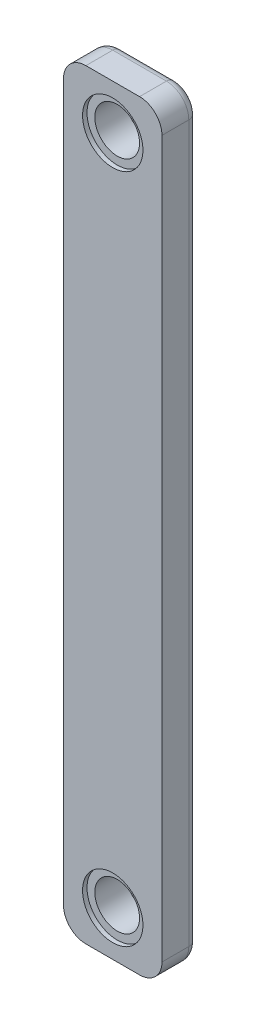
ISO-10303-21;
HEADER;
FILE_DESCRIPTION(('STEP AP214'),'2;1');
FILE_NAME('part.step','',(''),(''),'','','');
FILE_SCHEMA(('AUTOMOTIVE_DESIGN { 1 0 10303 214 1 1 1 1 }'));
ENDSEC;
DATA;
#1=APPLICATION_CONTEXT('core data for automotive mechanical design processes');
#2=APPLICATION_PROTOCOL_DEFINITION('international standard','automotive_design',2000,#1);
#3=PRODUCT_CONTEXT('',#1,'mechanical');
#4=PRODUCT('Part','Part','',(#3));
#5=PRODUCT_RELATED_PRODUCT_CATEGORY('part','',(#4));
#6=PRODUCT_DEFINITION_FORMATION('','',#4);
#7=PRODUCT_DEFINITION_CONTEXT('part definition',#1,'design');
#8=PRODUCT_DEFINITION('design','',#6,#7);
#9=PRODUCT_DEFINITION_SHAPE('','',#8);
#10=(LENGTH_UNIT() NAMED_UNIT(*) SI_UNIT(.MILLI.,.METRE.));
#11=(NAMED_UNIT(*) PLANE_ANGLE_UNIT() SI_UNIT($,.RADIAN.));
#12=(NAMED_UNIT(*) SI_UNIT($,.STERADIAN.) SOLID_ANGLE_UNIT());
#13=UNCERTAINTY_MEASURE_WITH_UNIT(LENGTH_MEASURE(1.E-05),#10,'distance_accuracy_value','');
#14=(GEOMETRIC_REPRESENTATION_CONTEXT(3) GLOBAL_UNCERTAINTY_ASSIGNED_CONTEXT((#13)) GLOBAL_UNIT_ASSIGNED_CONTEXT((#10,
#11,#12)) REPRESENTATION_CONTEXT('',''));
#15=CARTESIAN_POINT('',(0.,0.,0.));
#16=DIRECTION('',(0.,0.,1.));
#17=DIRECTION('',(1.,0.,0.));
#18=AXIS2_PLACEMENT_3D('',#15,#16,#17);
#19=CARTESIAN_POINT('',(0.,-75.,-4.));
#20=DIRECTION('',(0.,0.,1.));
#21=DIRECTION('',(1.,0.,0.));
#22=AXIS2_PLACEMENT_3D('',#19,#20,#21);
#23=CYLINDRICAL_SURFACE('',#22,5.);
#24=CARTESIAN_POINT('',(0.,-75.,-4.));
#25=DIRECTION('',(0.,0.,1.));
#26=DIRECTION('',(1.,0.,0.));
#27=AXIS2_PLACEMENT_3D('',#24,#25,#26);
#28=CIRCLE('',#27,5.);
#29=CARTESIAN_POINT('',(5.,-75.,-4.));
#30=VERTEX_POINT('',#29);
#31=EDGE_CURVE('E309',#30,#30,#28,.T.);
#32=ORIENTED_EDGE('',*,*,#31,.F.);
#33=EDGE_LOOP('',(#32));
#34=FACE_BOUND('',#33,.T.);
#35=CARTESIAN_POINT('',(0.,-75.,3.));
#36=DIRECTION('',(0.,0.,1.));
#37=DIRECTION('',(1.,0.,0.));
#38=AXIS2_PLACEMENT_3D('',#35,#36,#37);
#39=CIRCLE('',#38,5.);
#40=CARTESIAN_POINT('',(5.,-75.,3.));
#41=VERTEX_POINT('',#40);
#42=EDGE_CURVE('E63',#41,#41,#39,.F.);
#43=ORIENTED_EDGE('',*,*,#42,.F.);
#44=EDGE_LOOP('',(#43));
#45=FACE_BOUND('',#44,.T.);
#46=ADVANCED_FACE('F59',(#34,#45),#23,.F.);
#47=CARTESIAN_POINT('',(0.,75.,-4.));
#48=DIRECTION('',(0.,0.,1.));
#49=DIRECTION('',(1.,0.,0.));
#50=AXIS2_PLACEMENT_3D('',#47,#48,#49);
#51=CYLINDRICAL_SURFACE('',#50,5.);
#52=CARTESIAN_POINT('',(0.,75.,-4.));
#53=DIRECTION('',(0.,0.,1.));
#54=DIRECTION('',(1.,0.,0.));
#55=AXIS2_PLACEMENT_3D('',#52,#53,#54);
#56=CIRCLE('',#55,5.);
#57=CARTESIAN_POINT('',(5.,75.,-4.));
#58=VERTEX_POINT('',#57);
#59=EDGE_CURVE('E281',#58,#58,#56,.T.);
#60=ORIENTED_EDGE('',*,*,#59,.F.);
#61=EDGE_LOOP('',(#60));
#62=FACE_BOUND('',#61,.T.);
#63=CARTESIAN_POINT('',(0.,75.,3.));
#64=DIRECTION('',(0.,0.,1.));
#65=DIRECTION('',(1.,0.,0.));
#66=AXIS2_PLACEMENT_3D('',#63,#64,#65);
#67=CIRCLE('',#66,5.);
#68=CARTESIAN_POINT('',(5.,75.,3.));
#69=VERTEX_POINT('',#68);
#70=EDGE_CURVE('E306',#69,#69,#67,.F.);
#71=ORIENTED_EDGE('',*,*,#70,.F.);
#72=EDGE_LOOP('',(#71));
#73=FACE_BOUND('',#72,.T.);
#74=ADVANCED_FACE('F420',(#62,#73),#51,.F.);
#75=CARTESIAN_POINT('',(11.,-85.,4.));
#76=DIRECTION('',(-1.,0.,0.));
#77=DIRECTION('',(0.,0.,1.));
#78=AXIS2_PLACEMENT_3D('',#75,#76,#77);
#79=PLANE('',#78);
#80=DIRECTION('',(0.,0.,-1.));
#81=VECTOR('',#80,1.);
#82=CARTESIAN_POINT('',(11.,-80.,4.));
#83=LINE('',#82,#81);
#84=CARTESIAN_POINT('',(11.,-80.,4.));
#85=VERTEX_POINT('',#84);
#86=CARTESIAN_POINT('',(11.,-80.,-2.));
#87=VERTEX_POINT('',#86);
#88=EDGE_CURVE('E189',#85,#87,#83,.T.);
#89=ORIENTED_EDGE('',*,*,#88,.T.);
#90=DIRECTION('',(0.,1.,0.));
#91=VECTOR('',#90,1.);
#92=CARTESIAN_POINT('',(11.,80.,-2.));
#93=LINE('',#92,#91);
#94=CARTESIAN_POINT('',(11.,80.,-2.));
#95=VERTEX_POINT('',#94);
#96=EDGE_CURVE('E13',#87,#95,#93,.T.);
#97=ORIENTED_EDGE('',*,*,#96,.T.);
#98=DIRECTION('',(0.,0.,-1.));
#99=VECTOR('',#98,1.);
#100=CARTESIAN_POINT('',(11.,80.,4.));
#101=LINE('',#100,#99);
#102=CARTESIAN_POINT('',(11.,80.,4.));
#103=VERTEX_POINT('',#102);
#104=EDGE_CURVE('E192',#95,#103,#101,.F.);
#105=ORIENTED_EDGE('',*,*,#104,.T.);
#106=DIRECTION('',(0.,1.,0.));
#107=VECTOR('',#106,1.);
#108=CARTESIAN_POINT('',(11.,-85.,4.));
#109=LINE('',#108,#107);
#110=EDGE_CURVE('E179',#85,#103,#109,.T.);
#111=ORIENTED_EDGE('',*,*,#110,.F.);
#112=EDGE_LOOP('',(#89,#97,#105,#111));
#113=FACE_BOUND('',#112,.T.);
#114=ADVANCED_FACE('F188',(#113),#79,.F.);
#115=CARTESIAN_POINT('',(-11.,85.,4.));
#116=DIRECTION('',(0.,-1.,0.));
#117=DIRECTION('',(0.,0.,-1.));
#118=AXIS2_PLACEMENT_3D('',#115,#116,#117);
#119=PLANE('',#118);
#120=DIRECTION('',(0.,0.,-1.));
#121=VECTOR('',#120,1.);
#122=CARTESIAN_POINT('',(5.99999999999999,85.,4.));
#123=LINE('',#122,#121);
#124=CARTESIAN_POINT('',(5.99999999999999,85.,4.));
#125=VERTEX_POINT('',#124);
#126=CARTESIAN_POINT('',(5.99999999999999,85.,-2.));
#127=VERTEX_POINT('',#126);
#128=EDGE_CURVE('E226',#125,#127,#123,.T.);
#129=ORIENTED_EDGE('',*,*,#128,.T.);
#130=DIRECTION('',(-1.,0.,0.));
#131=VECTOR('',#130,1.);
#132=CARTESIAN_POINT('',(-6.,85.,-2.));
#133=LINE('',#132,#131);
#134=CARTESIAN_POINT('',(-6.,85.,-2.));
#135=VERTEX_POINT('',#134);
#136=EDGE_CURVE('E261',#127,#135,#133,.T.);
#137=ORIENTED_EDGE('',*,*,#136,.T.);
#138=DIRECTION('',(0.,0.,-1.));
#139=VECTOR('',#138,1.);
#140=CARTESIAN_POINT('',(-6.,85.,4.));
#141=LINE('',#140,#139);
#142=CARTESIAN_POINT('',(-6.,85.,4.));
#143=VERTEX_POINT('',#142);
#144=EDGE_CURVE('E230',#135,#143,#141,.F.);
#145=ORIENTED_EDGE('',*,*,#144,.T.);
#146=DIRECTION('',(-1.,0.,0.));
#147=VECTOR('',#146,1.);
#148=CARTESIAN_POINT('',(-11.,85.,4.));
#149=LINE('',#148,#147);
#150=EDGE_CURVE('E194',#125,#143,#149,.T.);
#151=ORIENTED_EDGE('',*,*,#150,.F.);
#152=EDGE_LOOP('',(#129,#137,#145,#151));
#153=FACE_BOUND('',#152,.T.);
#154=ADVANCED_FACE('F438',(#153),#119,.F.);
#155=CARTESIAN_POINT('',(-11.,-85.,4.));
#156=DIRECTION('',(1.,0.,0.));
#157=DIRECTION('',(0.,0.,-1.));
#158=AXIS2_PLACEMENT_3D('',#155,#156,#157);
#159=PLANE('',#158);
#160=DIRECTION('',(0.,0.,-1.));
#161=VECTOR('',#160,1.);
#162=CARTESIAN_POINT('',(-11.,80.,4.));
#163=LINE('',#162,#161);
#164=CARTESIAN_POINT('',(-11.,80.,4.));
#165=VERTEX_POINT('',#164);
#166=CARTESIAN_POINT('',(-11.,80.,-2.));
#167=VERTEX_POINT('',#166);
#168=EDGE_CURVE('E184',#165,#167,#163,.T.);
#169=ORIENTED_EDGE('',*,*,#168,.T.);
#170=DIRECTION('',(0.,-1.,0.));
#171=VECTOR('',#170,1.);
#172=CARTESIAN_POINT('',(-11.,-80.,-2.));
#173=LINE('',#172,#171);
#174=CARTESIAN_POINT('',(-11.,-80.,-2.));
#175=VERTEX_POINT('',#174);
#176=EDGE_CURVE('E267',#167,#175,#173,.T.);
#177=ORIENTED_EDGE('',*,*,#176,.T.);
#178=DIRECTION('',(0.,0.,-1.));
#179=VECTOR('',#178,1.);
#180=CARTESIAN_POINT('',(-11.,-80.,4.));
#181=LINE('',#180,#179);
#182=CARTESIAN_POINT('',(-11.,-80.,4.));
#183=VERTEX_POINT('',#182);
#184=EDGE_CURVE('E223',#175,#183,#181,.F.);
#185=ORIENTED_EDGE('',*,*,#184,.T.);
#186=DIRECTION('',(0.,-1.,0.));
#187=VECTOR('',#186,1.);
#188=CARTESIAN_POINT('',(-11.,-85.,4.));
#189=LINE('',#188,#187);
#190=EDGE_CURVE('E337',#165,#183,#189,.T.);
#191=ORIENTED_EDGE('',*,*,#190,.F.);
#192=EDGE_LOOP('',(#169,#177,#185,#191));
#193=FACE_BOUND('',#192,.T.);
#194=ADVANCED_FACE('F435',(#193),#159,.F.);
#195=CARTESIAN_POINT('',(-11.,-85.,4.));
#196=DIRECTION('',(0.,1.,0.));
#197=DIRECTION('',(0.,0.,1.));
#198=AXIS2_PLACEMENT_3D('',#195,#196,#197);
#199=PLANE('',#198);
#200=DIRECTION('',(0.,0.,-1.));
#201=VECTOR('',#200,1.);
#202=CARTESIAN_POINT('',(-6.,-85.,4.));
#203=LINE('',#202,#201);
#204=CARTESIAN_POINT('',(-6.,-85.,4.));
#205=VERTEX_POINT('',#204);
#206=CARTESIAN_POINT('',(-6.,-85.,-2.));
#207=VERTEX_POINT('',#206);
#208=EDGE_CURVE('E199',#205,#207,#203,.T.);
#209=ORIENTED_EDGE('',*,*,#208,.T.);
#210=DIRECTION('',(1.,0.,0.));
#211=VECTOR('',#210,1.);
#212=CARTESIAN_POINT('',(5.99999999999999,-85.,-2.));
#213=LINE('',#212,#211);
#214=CARTESIAN_POINT('',(5.99999999999999,-85.,-2.));
#215=VERTEX_POINT('',#214);
#216=EDGE_CURVE('E90',#207,#215,#213,.T.);
#217=ORIENTED_EDGE('',*,*,#216,.T.);
#218=DIRECTION('',(0.,0.,-1.));
#219=VECTOR('',#218,1.);
#220=CARTESIAN_POINT('',(5.99999999999999,-85.,4.));
#221=LINE('',#220,#219);
#222=CARTESIAN_POINT('',(5.99999999999999,-85.,4.));
#223=VERTEX_POINT('',#222);
#224=EDGE_CURVE('E205',#215,#223,#221,.F.);
#225=ORIENTED_EDGE('',*,*,#224,.T.);
#226=DIRECTION('',(1.,0.,0.));
#227=VECTOR('',#226,1.);
#228=CARTESIAN_POINT('',(-11.,-85.,4.));
#229=LINE('',#228,#227);
#230=EDGE_CURVE('E182',#205,#223,#229,.T.);
#231=ORIENTED_EDGE('',*,*,#230,.F.);
#232=EDGE_LOOP('',(#209,#217,#225,#231));
#233=FACE_BOUND('',#232,.T.);
#234=ADVANCED_FACE('F400',(#233),#199,.F.);
#235=CARTESIAN_POINT('',(0.,0.,4.));
#236=DIRECTION('',(0.,0.,-1.));
#237=DIRECTION('',(-1.,0.,0.));
#238=AXIS2_PLACEMENT_3D('',#235,#236,#237);
#239=PLANE('',#238);
#240=CARTESIAN_POINT('',(0.,-75.,4.));
#241=DIRECTION('',(0.,0.,1.));
#242=DIRECTION('',(1.,0.,0.));
#243=AXIS2_PLACEMENT_3D('',#240,#241,#242);
#244=CIRCLE('',#243,6.75);
#245=CARTESIAN_POINT('',(6.75,-75.,4.));
#246=VERTEX_POINT('',#245);
#247=EDGE_CURVE('E328',#246,#246,#244,.T.);
#248=ORIENTED_EDGE('',*,*,#247,.F.);
#249=EDGE_LOOP('',(#248));
#250=FACE_BOUND('',#249,.T.);
#251=CARTESIAN_POINT('',(0.,75.,4.));
#252=DIRECTION('',(0.,0.,1.));
#253=DIRECTION('',(1.,0.,0.));
#254=AXIS2_PLACEMENT_3D('',#251,#252,#253);
#255=CIRCLE('',#254,6.75);
#256=CARTESIAN_POINT('',(6.75,75.,4.));
#257=VERTEX_POINT('',#256);
#258=EDGE_CURVE('E319',#257,#257,#255,.T.);
#259=ORIENTED_EDGE('',*,*,#258,.F.);
#260=EDGE_LOOP('',(#259));
#261=FACE_BOUND('',#260,.T.);
#262=ORIENTED_EDGE('',*,*,#230,.T.);
#263=CARTESIAN_POINT('',(6.,-80.,4.));
#264=DIRECTION('',(0.,0.,-1.));
#265=DIRECTION('',(-1.,0.,0.));
#266=AXIS2_PLACEMENT_3D('',#263,#264,#265);
#267=CIRCLE('',#266,5.);
#268=EDGE_CURVE('E176',#223,#85,#267,.F.);
#269=ORIENTED_EDGE('',*,*,#268,.T.);
#270=ORIENTED_EDGE('',*,*,#110,.T.);
#271=CARTESIAN_POINT('',(5.99999999999999,80.,4.));
#272=DIRECTION('',(0.,0.,-1.));
#273=DIRECTION('',(-1.,0.,0.));
#274=AXIS2_PLACEMENT_3D('',#271,#272,#273);
#275=CIRCLE('',#274,5.);
#276=EDGE_CURVE('E213',#103,#125,#275,.F.);
#277=ORIENTED_EDGE('',*,*,#276,.T.);
#278=ORIENTED_EDGE('',*,*,#150,.T.);
#279=CARTESIAN_POINT('',(-6.,80.,4.));
#280=DIRECTION('',(0.,0.,-1.));
#281=DIRECTION('',(-1.,0.,0.));
#282=AXIS2_PLACEMENT_3D('',#279,#280,#281);
#283=CIRCLE('',#282,5.);
#284=EDGE_CURVE('E216',#143,#165,#283,.F.);
#285=ORIENTED_EDGE('',*,*,#284,.T.);
#286=ORIENTED_EDGE('',*,*,#190,.T.);
#287=CARTESIAN_POINT('',(-6.,-80.,4.));
#288=DIRECTION('',(0.,0.,-1.));
#289=DIRECTION('',(-1.,0.,0.));
#290=AXIS2_PLACEMENT_3D('',#287,#288,#289);
#291=CIRCLE('',#290,5.);
#292=EDGE_CURVE('E185',#183,#205,#291,.F.);
#293=ORIENTED_EDGE('',*,*,#292,.T.);
#294=EDGE_LOOP('',(#262,#269,#270,#277,#278,#285,#286,#293));
#295=FACE_BOUND('',#294,.T.);
#296=ADVANCED_FACE('F178',(#250,#261,#295),#239,.F.);
#297=CARTESIAN_POINT('',(0.,0.,-4.));
#298=DIRECTION('',(0.,0.,-1.));
#299=DIRECTION('',(-1.,0.,0.));
#300=AXIS2_PLACEMENT_3D('',#297,#298,#299);
#301=PLANE('',#300);
#302=ORIENTED_EDGE('',*,*,#31,.T.);
#303=EDGE_LOOP('',(#302));
#304=FACE_BOUND('',#303,.T.);
#305=ORIENTED_EDGE('',*,*,#59,.T.);
#306=EDGE_LOOP('',(#305));
#307=FACE_BOUND('',#306,.T.);
#308=DIRECTION('',(-1.,0.,0.));
#309=VECTOR('',#308,1.);
#310=CARTESIAN_POINT('',(5.99999999999999,83.,-4.));
#311=LINE('',#310,#309);
#312=CARTESIAN_POINT('',(-6.,83.,-4.));
#313=VERTEX_POINT('',#312);
#314=CARTESIAN_POINT('',(5.99999999999999,83.,-4.));
#315=VERTEX_POINT('',#314);
#316=EDGE_CURVE('E250',#313,#315,#311,.F.);
#317=ORIENTED_EDGE('',*,*,#316,.T.);
#318=CARTESIAN_POINT('',(5.99999999999999,80.,-4.));
#319=DIRECTION('',(0.,0.,-1.));
#320=DIRECTION('',(-1.,0.,0.));
#321=AXIS2_PLACEMENT_3D('',#318,#319,#320);
#322=CIRCLE('',#321,3.);
#323=CARTESIAN_POINT('',(9.,80.,-4.));
#324=VERTEX_POINT('',#323);
#325=EDGE_CURVE('E253',#315,#324,#322,.T.);
#326=ORIENTED_EDGE('',*,*,#325,.T.);
#327=DIRECTION('',(0.,1.,0.));
#328=VECTOR('',#327,1.);
#329=CARTESIAN_POINT('',(9.,-80.,-4.));
#330=LINE('',#329,#328);
#331=CARTESIAN_POINT('',(9.,-80.,-4.));
#332=VERTEX_POINT('',#331);
#333=EDGE_CURVE('E233',#324,#332,#330,.F.);
#334=ORIENTED_EDGE('',*,*,#333,.T.);
#335=CARTESIAN_POINT('',(6.,-80.,-4.));
#336=DIRECTION('',(0.,0.,-1.));
#337=DIRECTION('',(-1.,0.,0.));
#338=AXIS2_PLACEMENT_3D('',#335,#336,#337);
#339=CIRCLE('',#338,3.);
#340=CARTESIAN_POINT('',(5.99999999999999,-83.,-4.));
#341=VERTEX_POINT('',#340);
#342=EDGE_CURVE('E236',#332,#341,#339,.T.);
#343=ORIENTED_EDGE('',*,*,#342,.T.);
#344=DIRECTION('',(1.,0.,0.));
#345=VECTOR('',#344,1.);
#346=CARTESIAN_POINT('',(-6.,-83.,-4.));
#347=LINE('',#346,#345);
#348=CARTESIAN_POINT('',(-6.,-83.,-4.));
#349=VERTEX_POINT('',#348);
#350=EDGE_CURVE('E238',#341,#349,#347,.F.);
#351=ORIENTED_EDGE('',*,*,#350,.T.);
#352=CARTESIAN_POINT('',(-6.,-80.,-4.));
#353=DIRECTION('',(0.,0.,-1.));
#354=DIRECTION('',(-1.,0.,0.));
#355=AXIS2_PLACEMENT_3D('',#352,#353,#354);
#356=CIRCLE('',#355,3.);
#357=CARTESIAN_POINT('',(-9.,-80.,-4.));
#358=VERTEX_POINT('',#357);
#359=EDGE_CURVE('E241',#349,#358,#356,.T.);
#360=ORIENTED_EDGE('',*,*,#359,.T.);
#361=DIRECTION('',(0.,-1.,0.));
#362=VECTOR('',#361,1.);
#363=CARTESIAN_POINT('',(-9.,80.,-4.));
#364=LINE('',#363,#362);
#365=CARTESIAN_POINT('',(-9.,80.,-4.));
#366=VERTEX_POINT('',#365);
#367=EDGE_CURVE('E244',#358,#366,#364,.F.);
#368=ORIENTED_EDGE('',*,*,#367,.T.);
#369=CARTESIAN_POINT('',(-6.,80.,-4.));
#370=DIRECTION('',(0.,0.,-1.));
#371=DIRECTION('',(-1.,0.,0.));
#372=AXIS2_PLACEMENT_3D('',#369,#370,#371);
#373=CIRCLE('',#372,3.);
#374=EDGE_CURVE('E247',#366,#313,#373,.T.);
#375=ORIENTED_EDGE('',*,*,#374,.T.);
#376=EDGE_LOOP('',(#317,#326,#334,#343,#351,#360,#368,#375));
#377=FACE_BOUND('',#376,.T.);
#378=ADVANCED_FACE('F399',(#304,#307,#377),#301,.T.);
#379=CARTESIAN_POINT('',(6.,-80.,4.));
#380=DIRECTION('',(0.,0.,-1.));
#381=DIRECTION('',(-1.,0.,0.));
#382=AXIS2_PLACEMENT_3D('',#379,#380,#381);
#383=CYLINDRICAL_SURFACE('',#382,5.);
#384=ORIENTED_EDGE('',*,*,#224,.F.);
#385=CARTESIAN_POINT('',(6.,-80.,-2.));
#386=DIRECTION('',(0.,0.,-1.));
#387=DIRECTION('',(-1.,0.,0.));
#388=AXIS2_PLACEMENT_3D('',#385,#386,#387);
#389=CIRCLE('',#388,5.);
#390=EDGE_CURVE('E69',#215,#87,#389,.F.);
#391=ORIENTED_EDGE('',*,*,#390,.T.);
#392=ORIENTED_EDGE('',*,*,#88,.F.);
#393=ORIENTED_EDGE('',*,*,#268,.F.);
#394=EDGE_LOOP('',(#384,#391,#392,#393));
#395=FACE_BOUND('',#394,.T.);
#396=ADVANCED_FACE('F197',(#395),#383,.T.);
#397=CARTESIAN_POINT('',(-6.,-80.,4.));
#398=DIRECTION('',(0.,0.,-1.));
#399=DIRECTION('',(-1.,0.,0.));
#400=AXIS2_PLACEMENT_3D('',#397,#398,#399);
#401=CYLINDRICAL_SURFACE('',#400,5.);
#402=ORIENTED_EDGE('',*,*,#184,.F.);
#403=CARTESIAN_POINT('',(-6.,-80.,-2.));
#404=DIRECTION('',(0.,0.,-1.));
#405=DIRECTION('',(-1.,0.,0.));
#406=AXIS2_PLACEMENT_3D('',#403,#404,#405);
#407=CIRCLE('',#406,5.);
#408=EDGE_CURVE('E270',#175,#207,#407,.F.);
#409=ORIENTED_EDGE('',*,*,#408,.T.);
#410=ORIENTED_EDGE('',*,*,#208,.F.);
#411=ORIENTED_EDGE('',*,*,#292,.F.);
#412=EDGE_LOOP('',(#402,#409,#410,#411));
#413=FACE_BOUND('',#412,.T.);
#414=ADVANCED_FACE('F447',(#413),#401,.T.);
#415=CARTESIAN_POINT('',(-6.,80.,4.));
#416=DIRECTION('',(0.,0.,-1.));
#417=DIRECTION('',(-1.,0.,0.));
#418=AXIS2_PLACEMENT_3D('',#415,#416,#417);
#419=CYLINDRICAL_SURFACE('',#418,5.);
#420=ORIENTED_EDGE('',*,*,#144,.F.);
#421=CARTESIAN_POINT('',(-6.,80.,-2.));
#422=DIRECTION('',(0.,0.,-1.));
#423=DIRECTION('',(-1.,0.,0.));
#424=AXIS2_PLACEMENT_3D('',#421,#422,#423);
#425=CIRCLE('',#424,5.);
#426=EDGE_CURVE('E264',#135,#167,#425,.F.);
#427=ORIENTED_EDGE('',*,*,#426,.T.);
#428=ORIENTED_EDGE('',*,*,#168,.F.);
#429=ORIENTED_EDGE('',*,*,#284,.F.);
#430=EDGE_LOOP('',(#420,#427,#428,#429));
#431=FACE_BOUND('',#430,.T.);
#432=ADVANCED_FACE('F450',(#431),#419,.T.);
#433=CARTESIAN_POINT('',(5.99999999999999,80.,4.));
#434=DIRECTION('',(0.,0.,-1.));
#435=DIRECTION('',(-1.,0.,0.));
#436=AXIS2_PLACEMENT_3D('',#433,#434,#435);
#437=CYLINDRICAL_SURFACE('',#436,5.);
#438=ORIENTED_EDGE('',*,*,#104,.F.);
#439=CARTESIAN_POINT('',(5.99999999999999,80.,-2.));
#440=DIRECTION('',(0.,0.,-1.));
#441=DIRECTION('',(-1.,0.,0.));
#442=AXIS2_PLACEMENT_3D('',#439,#440,#441);
#443=CIRCLE('',#442,5.);
#444=EDGE_CURVE('E257',#95,#127,#443,.F.);
#445=ORIENTED_EDGE('',*,*,#444,.T.);
#446=ORIENTED_EDGE('',*,*,#128,.F.);
#447=ORIENTED_EDGE('',*,*,#276,.F.);
#448=EDGE_LOOP('',(#438,#445,#446,#447));
#449=FACE_BOUND('',#448,.T.);
#450=ADVANCED_FACE('F454',(#449),#437,.T.);
#451=CARTESIAN_POINT('',(-6.,-80.,-2.));
#452=DIRECTION('',(0.,0.,-1.));
#453=DIRECTION('',(-1.,0.,0.));
#454=AXIS2_PLACEMENT_3D('',#451,#452,#453);
#455=TOROIDAL_SURFACE('',#454,3.,2.);
#456=CARTESIAN_POINT('',(-6.,-83.,-2.));
#457=DIRECTION('',(1.,0.,0.));
#458=DIRECTION('',(0.,0.,-1.));
#459=AXIS2_PLACEMENT_3D('',#456,#457,#458);
#460=CIRCLE('',#459,2.);
#461=EDGE_CURVE('E300',#207,#349,#460,.T.);
#462=ORIENTED_EDGE('',*,*,#461,.F.);
#463=ORIENTED_EDGE('',*,*,#408,.F.);
#464=CARTESIAN_POINT('',(-9.,-80.,-2.));
#465=DIRECTION('',(0.,1.,0.));
#466=DIRECTION('',(0.,0.,1.));
#467=AXIS2_PLACEMENT_3D('',#464,#465,#466);
#468=CIRCLE('',#467,2.);
#469=EDGE_CURVE('E195',#358,#175,#468,.T.);
#470=ORIENTED_EDGE('',*,*,#469,.F.);
#471=ORIENTED_EDGE('',*,*,#359,.F.);
#472=EDGE_LOOP('',(#462,#463,#470,#471));
#473=FACE_BOUND('',#472,.T.);
#474=ADVANCED_FACE('F61',(#473),#455,.T.);
#475=CARTESIAN_POINT('',(-9.,-85.,-2.));
#476=DIRECTION('',(0.,1.,0.));
#477=DIRECTION('',(0.,0.,1.));
#478=AXIS2_PLACEMENT_3D('',#475,#476,#477);
#479=CYLINDRICAL_SURFACE('',#478,2.);
#480=ORIENTED_EDGE('',*,*,#469,.T.);
#481=ORIENTED_EDGE('',*,*,#176,.F.);
#482=CARTESIAN_POINT('',(-9.,80.,-2.));
#483=DIRECTION('',(0.,1.,0.));
#484=DIRECTION('',(0.,0.,1.));
#485=AXIS2_PLACEMENT_3D('',#482,#483,#484);
#486=CIRCLE('',#485,2.);
#487=EDGE_CURVE('E296',#366,#167,#486,.T.);
#488=ORIENTED_EDGE('',*,*,#487,.F.);
#489=ORIENTED_EDGE('',*,*,#367,.F.);
#490=EDGE_LOOP('',(#480,#481,#488,#489));
#491=FACE_BOUND('',#490,.T.);
#492=ADVANCED_FACE('F480',(#491),#479,.T.);
#493=CARTESIAN_POINT('',(-11.,-83.,-2.));
#494=DIRECTION('',(-1.,0.,0.));
#495=DIRECTION('',(0.,0.,1.));
#496=AXIS2_PLACEMENT_3D('',#493,#494,#495);
#497=CYLINDRICAL_SURFACE('',#496,2.);
#498=ORIENTED_EDGE('',*,*,#461,.T.);
#499=ORIENTED_EDGE('',*,*,#350,.F.);
#500=CARTESIAN_POINT('',(5.99999999999999,-83.,-2.));
#501=DIRECTION('',(1.,0.,0.));
#502=DIRECTION('',(0.,0.,-1.));
#503=AXIS2_PLACEMENT_3D('',#500,#501,#502);
#504=CIRCLE('',#503,2.);
#505=EDGE_CURVE('E292',#215,#341,#504,.T.);
#506=ORIENTED_EDGE('',*,*,#505,.F.);
#507=ORIENTED_EDGE('',*,*,#216,.F.);
#508=EDGE_LOOP('',(#498,#499,#506,#507));
#509=FACE_BOUND('',#508,.T.);
#510=ADVANCED_FACE('F477',(#509),#497,.T.);
#511=CARTESIAN_POINT('',(-6.,80.,-2.));
#512=DIRECTION('',(0.,0.,-1.));
#513=DIRECTION('',(-1.,0.,0.));
#514=AXIS2_PLACEMENT_3D('',#511,#512,#513);
#515=TOROIDAL_SURFACE('',#514,3.,2.);
#516=ORIENTED_EDGE('',*,*,#487,.T.);
#517=ORIENTED_EDGE('',*,*,#426,.F.);
#518=CARTESIAN_POINT('',(-6.,83.,-2.));
#519=DIRECTION('',(1.,0.,0.));
#520=DIRECTION('',(0.,0.,-1.));
#521=AXIS2_PLACEMENT_3D('',#518,#519,#520);
#522=CIRCLE('',#521,2.);
#523=EDGE_CURVE('E288',#313,#135,#522,.T.);
#524=ORIENTED_EDGE('',*,*,#523,.F.);
#525=ORIENTED_EDGE('',*,*,#374,.F.);
#526=EDGE_LOOP('',(#516,#517,#524,#525));
#527=FACE_BOUND('',#526,.T.);
#528=ADVANCED_FACE('F473',(#527),#515,.T.);
#529=CARTESIAN_POINT('',(6.,-80.,-2.));
#530=DIRECTION('',(0.,0.,-1.));
#531=DIRECTION('',(-1.,0.,0.));
#532=AXIS2_PLACEMENT_3D('',#529,#530,#531);
#533=TOROIDAL_SURFACE('',#532,3.,2.);
#534=ORIENTED_EDGE('',*,*,#505,.T.);
#535=ORIENTED_EDGE('',*,*,#342,.F.);
#536=CARTESIAN_POINT('',(9.,-80.,-2.));
#537=DIRECTION('',(0.,1.,0.));
#538=DIRECTION('',(0.,0.,1.));
#539=AXIS2_PLACEMENT_3D('',#536,#537,#538);
#540=CIRCLE('',#539,2.);
#541=EDGE_CURVE('E284',#87,#332,#540,.T.);
#542=ORIENTED_EDGE('',*,*,#541,.F.);
#543=ORIENTED_EDGE('',*,*,#390,.F.);
#544=EDGE_LOOP('',(#534,#535,#542,#543));
#545=FACE_BOUND('',#544,.T.);
#546=ADVANCED_FACE('F469',(#545),#533,.T.);
#547=CARTESIAN_POINT('',(-11.,83.,-2.));
#548=DIRECTION('',(1.,0.,0.));
#549=DIRECTION('',(0.,0.,-1.));
#550=AXIS2_PLACEMENT_3D('',#547,#548,#549);
#551=CYLINDRICAL_SURFACE('',#550,2.);
#552=ORIENTED_EDGE('',*,*,#523,.T.);
#553=ORIENTED_EDGE('',*,*,#136,.F.);
#554=CARTESIAN_POINT('',(5.99999999999999,83.,-2.));
#555=DIRECTION('',(1.,0.,0.));
#556=DIRECTION('',(0.,0.,-1.));
#557=AXIS2_PLACEMENT_3D('',#554,#555,#556);
#558=CIRCLE('',#557,2.);
#559=EDGE_CURVE('E280',#315,#127,#558,.T.);
#560=ORIENTED_EDGE('',*,*,#559,.F.);
#561=ORIENTED_EDGE('',*,*,#316,.F.);
#562=EDGE_LOOP('',(#552,#553,#560,#561));
#563=FACE_BOUND('',#562,.T.);
#564=ADVANCED_FACE('F465',(#563),#551,.T.);
#565=CARTESIAN_POINT('',(9.,-85.,-2.));
#566=DIRECTION('',(0.,-1.,0.));
#567=DIRECTION('',(0.,0.,-1.));
#568=AXIS2_PLACEMENT_3D('',#565,#566,#567);
#569=CYLINDRICAL_SURFACE('',#568,2.);
#570=ORIENTED_EDGE('',*,*,#541,.T.);
#571=ORIENTED_EDGE('',*,*,#333,.F.);
#572=CARTESIAN_POINT('',(9.,80.,-2.));
#573=DIRECTION('',(0.,1.,0.));
#574=DIRECTION('',(0.,0.,1.));
#575=AXIS2_PLACEMENT_3D('',#572,#573,#574);
#576=CIRCLE('',#575,2.);
#577=EDGE_CURVE('E277',#95,#324,#576,.T.);
#578=ORIENTED_EDGE('',*,*,#577,.F.);
#579=ORIENTED_EDGE('',*,*,#96,.F.);
#580=EDGE_LOOP('',(#570,#571,#578,#579));
#581=FACE_BOUND('',#580,.T.);
#582=ADVANCED_FACE('F461',(#581),#569,.T.);
#583=CARTESIAN_POINT('',(5.99999999999999,80.,-2.));
#584=DIRECTION('',(0.,0.,-1.));
#585=DIRECTION('',(-1.,0.,0.));
#586=AXIS2_PLACEMENT_3D('',#583,#584,#585);
#587=TOROIDAL_SURFACE('',#586,3.,2.);
#588=ORIENTED_EDGE('',*,*,#559,.T.);
#589=ORIENTED_EDGE('',*,*,#444,.F.);
#590=ORIENTED_EDGE('',*,*,#577,.T.);
#591=ORIENTED_EDGE('',*,*,#325,.F.);
#592=EDGE_LOOP('',(#588,#589,#590,#591));
#593=FACE_BOUND('',#592,.T.);
#594=ADVANCED_FACE('F416',(#593),#587,.T.);
#595=CARTESIAN_POINT('',(0.,75.,3.));
#596=DIRECTION('',(0.,0.,1.));
#597=DIRECTION('',(1.,0.,0.));
#598=AXIS2_PLACEMENT_3D('',#595,#596,#597);
#599=PLANE('',#598);
#600=CARTESIAN_POINT('',(0.,75.,3.));
#601=DIRECTION('',(0.,0.,1.));
#602=DIRECTION('',(1.,0.,0.));
#603=AXIS2_PLACEMENT_3D('',#600,#601,#602);
#604=CIRCLE('',#603,6.75);
#605=CARTESIAN_POINT('',(6.75,75.,3.));
#606=VERTEX_POINT('',#605);
#607=EDGE_CURVE('E310',#606,#606,#604,.T.);
#608=ORIENTED_EDGE('',*,*,#607,.T.);
#609=EDGE_LOOP('',(#608));
#610=FACE_BOUND('',#609,.T.);
#611=ORIENTED_EDGE('',*,*,#70,.T.);
#612=EDGE_LOOP('',(#611));
#613=FACE_BOUND('',#612,.T.);
#614=ADVANCED_FACE('F407',(#610,#613),#599,.T.);
#615=CARTESIAN_POINT('',(0.,75.,3.));
#616=DIRECTION('',(0.,0.,1.));
#617=DIRECTION('',(1.,0.,0.));
#618=AXIS2_PLACEMENT_3D('',#615,#616,#617);
#619=CYLINDRICAL_SURFACE('',#618,6.75);
#620=ORIENTED_EDGE('',*,*,#607,.F.);
#621=EDGE_LOOP('',(#620));
#622=FACE_BOUND('',#621,.T.);
#623=ORIENTED_EDGE('',*,*,#258,.T.);
#624=EDGE_LOOP('',(#623));
#625=FACE_BOUND('',#624,.T.);
#626=ADVANCED_FACE('F404',(#622,#625),#619,.F.);
#627=CARTESIAN_POINT('',(0.,-75.,3.));
#628=DIRECTION('',(0.,0.,1.));
#629=DIRECTION('',(1.,0.,0.));
#630=AXIS2_PLACEMENT_3D('',#627,#628,#629);
#631=PLANE('',#630);
#632=CARTESIAN_POINT('',(0.,-75.,3.));
#633=DIRECTION('',(0.,0.,1.));
#634=DIRECTION('',(1.,0.,0.));
#635=AXIS2_PLACEMENT_3D('',#632,#633,#634);
#636=CIRCLE('',#635,6.75);
#637=CARTESIAN_POINT('',(6.75,-75.,3.));
#638=VERTEX_POINT('',#637);
#639=EDGE_CURVE('E368',#638,#638,#636,.T.);
#640=ORIENTED_EDGE('',*,*,#639,.T.);
#641=EDGE_LOOP('',(#640));
#642=FACE_BOUND('',#641,.T.);
#643=ORIENTED_EDGE('',*,*,#42,.T.);
#644=EDGE_LOOP('',(#643));
#645=FACE_BOUND('',#644,.T.);
#646=ADVANCED_FACE('F406',(#642,#645),#631,.T.);
#647=CARTESIAN_POINT('',(0.,-75.,3.));
#648=DIRECTION('',(0.,0.,1.));
#649=DIRECTION('',(1.,0.,0.));
#650=AXIS2_PLACEMENT_3D('',#647,#648,#649);
#651=CYLINDRICAL_SURFACE('',#650,6.75);
#652=ORIENTED_EDGE('',*,*,#639,.F.);
#653=EDGE_LOOP('',(#652));
#654=FACE_BOUND('',#653,.T.);
#655=ORIENTED_EDGE('',*,*,#247,.T.);
#656=EDGE_LOOP('',(#655));
#657=FACE_BOUND('',#656,.T.);
#658=ADVANCED_FACE('F395',(#654,#657),#651,.F.);
#659=CLOSED_SHELL('',(#46,#74,#114,#154,#194,#234,#296,#378,#396,#414,#432,#450,#474,#492,#510,
#528,#546,#564,#582,#594,#614,#626,#646,#658));
#660=MANIFOLD_SOLID_BREP('B2',#659);
#661=ADVANCED_BREP_SHAPE_REPRESENTATION('',(#18,#660),#14);
#662=SHAPE_DEFINITION_REPRESENTATION(#9,#661);
ENDSEC;
END-ISO-10303-21;
